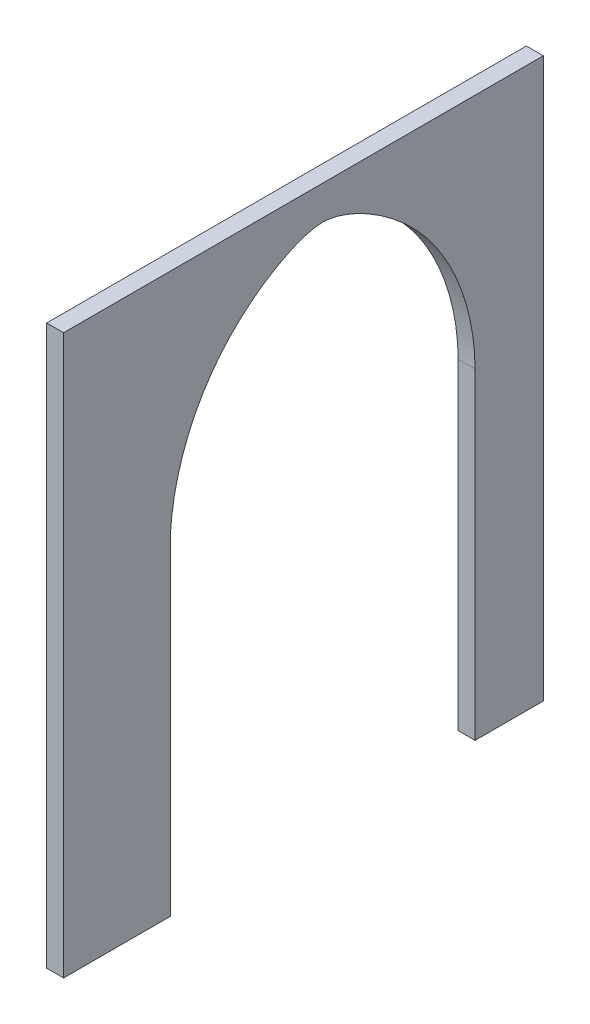
ISO-10303-21;
HEADER;
FILE_DESCRIPTION(('STEP AP214'),'2;1');
FILE_NAME('part.step','',(''),(''),'','','');
FILE_SCHEMA(('AUTOMOTIVE_DESIGN { 1 0 10303 214 1 1 1 1 }'));
ENDSEC;
DATA;
#1=APPLICATION_CONTEXT('core data for automotive mechanical design processes');
#2=APPLICATION_PROTOCOL_DEFINITION('international standard','automotive_design',2000,#1);
#3=PRODUCT_CONTEXT('',#1,'mechanical');
#4=PRODUCT('Part','Part','',(#3));
#5=PRODUCT_RELATED_PRODUCT_CATEGORY('part','',(#4));
#6=PRODUCT_DEFINITION_FORMATION('','',#4);
#7=PRODUCT_DEFINITION_CONTEXT('part definition',#1,'design');
#8=PRODUCT_DEFINITION('design','',#6,#7);
#9=PRODUCT_DEFINITION_SHAPE('','',#8);
#10=(LENGTH_UNIT() NAMED_UNIT(*) SI_UNIT(.MILLI.,.METRE.));
#11=(NAMED_UNIT(*) PLANE_ANGLE_UNIT() SI_UNIT($,.RADIAN.));
#12=(NAMED_UNIT(*) SI_UNIT($,.STERADIAN.) SOLID_ANGLE_UNIT());
#13=UNCERTAINTY_MEASURE_WITH_UNIT(LENGTH_MEASURE(1.E-05),#10,'distance_accuracy_value','');
#14=(GEOMETRIC_REPRESENTATION_CONTEXT(3) GLOBAL_UNCERTAINTY_ASSIGNED_CONTEXT((#13)) GLOBAL_UNIT_ASSIGNED_CONTEXT((#10,
#11,#12)) REPRESENTATION_CONTEXT('',''));
#15=CARTESIAN_POINT('',(0.,0.,0.));
#16=DIRECTION('',(0.,0.,1.));
#17=DIRECTION('',(1.,0.,0.));
#18=AXIS2_PLACEMENT_3D('',#15,#16,#17);
#19=CARTESIAN_POINT('',(595.,-635.,101.338597068016));
#20=DIRECTION('',(1.,0.,0.));
#21=DIRECTION('',(0.,1.,0.));
#22=AXIS2_PLACEMENT_3D('',#19,#20,#21);
#23=PLANE('',#22);
#24=DIRECTION('',(0.,0.,1.));
#25=VECTOR('',#24,1.);
#26=CARTESIAN_POINT('',(595.,-800.,242.977194136031));
#27=LINE('',#26,#25);
#28=CARTESIAN_POINT('',(595.,-800.,-40.3));
#29=VERTEX_POINT('',#28);
#30=CARTESIAN_POINT('',(595.,-800.,0.));
#31=VERTEX_POINT('',#30);
#32=EDGE_CURVE('E11',#29,#31,#27,.T.);
#33=ORIENTED_EDGE('',*,*,#32,.T.);
#34=DIRECTION('',(0.,1.,0.));
#35=VECTOR('',#34,1.);
#36=CARTESIAN_POINT('',(595.,-890.,0.));
#37=LINE('',#36,#35);
#38=CARTESIAN_POINT('',(595.,-610.,0.));
#39=VERTEX_POINT('',#38);
#40=EDGE_CURVE('E20',#31,#39,#37,.T.);
#41=ORIENTED_EDGE('',*,*,#40,.T.);
#42=CARTESIAN_POINT('',(595.,-610.,0.));
#43=CARTESIAN_POINT('',(595.,-607.078784666589,0.));
#44=CARTESIAN_POINT('',(595.,-601.118838253631,0.197661400638183));
#45=CARTESIAN_POINT('',(595.,-591.826391830275,1.08708198669646));
#46=CARTESIAN_POINT('',(595.,-578.820859051783,3.49931149063346));
#47=CARTESIAN_POINT('',(595.,-562.062676040517,8.76610130034009));
#48=CARTESIAN_POINT('',(595.,-545.512964245755,16.4928658029762));
#49=CARTESIAN_POINT('',(595.,-529.958861830291,26.7349755565135));
#50=CARTESIAN_POINT('',(595.,-516.173316725885,39.2472414722535));
#51=CARTESIAN_POINT('',(595.,-504.772887327885,53.1804665942254));
#52=CARTESIAN_POINT('',(595.,-496.226027489628,67.2507411920611));
#53=CARTESIAN_POINT('',(595.,-491.97245126361,77.5459269277937));
#54=CARTESIAN_POINT('',(595.,-490.358632607111,84.23316645146));
#55=CARTESIAN_POINT('',(595.,-490.,88.1653943535972));
#56=CARTESIAN_POINT('',(595.,-490.,90.));
#57=(BOUNDED_CURVE() B_SPLINE_CURVE(5,(#42,#43,#44,#45,#46,#47,#48,#49,#50,#51,#52,#53,#54,#55,
#56),.UNSPECIFIED.,.F.,.F.) B_SPLINE_CURVE_WITH_KNOTS((6,1,1,1,1,1,1,1,1,1,6),(-1.,-0.9,-0.8,
-0.7,-0.6,-0.5,-0.4,-0.3,-0.2,-0.1,0.),
.UNSPECIFIED.) CURVE() GEOMETRIC_REPRESENTATION_ITEM() RATIONAL_B_SPLINE_CURVE((1.,1.,1.,1.,1.,
1.,1.,1.,1.,1.,1.,1.,1.,1.,1.)) REPRESENTATION_ITEM(''));
#58=CARTESIAN_POINT('',(595.,-490.,90.));
#59=VERTEX_POINT('',#58);
#60=EDGE_CURVE('E118',#39,#59,#57,.T.);
#61=ORIENTED_EDGE('',*,*,#60,.T.);
#62=CARTESIAN_POINT('',(595.,-490.,90.));
#63=CARTESIAN_POINT('',(595.,-490.,91.8346056464028));
#64=CARTESIAN_POINT('',(595.,-490.358632607111,95.7668335485396));
#65=CARTESIAN_POINT('',(595.,-491.97245126361,102.454073072204));
#66=CARTESIAN_POINT('',(595.,-496.226027489628,112.749258807935));
#67=CARTESIAN_POINT('',(595.,-504.772887327885,126.819533405771));
#68=CARTESIAN_POINT('',(595.,-516.173316725885,140.752758527745));
#69=CARTESIAN_POINT('',(595.,-529.958861830291,153.265024443487));
#70=CARTESIAN_POINT('',(595.,-545.512964245755,163.507134197026));
#71=CARTESIAN_POINT('',(595.,-562.062676040517,171.233898699662));
#72=CARTESIAN_POINT('',(595.,-578.820859051783,176.500688509368));
#73=CARTESIAN_POINT('',(595.,-591.826391830275,178.912918013304));
#74=CARTESIAN_POINT('',(595.,-601.118838253631,179.802338599362));
#75=CARTESIAN_POINT('',(595.,-607.078784666589,180.));
#76=CARTESIAN_POINT('',(595.,-610.,180.));
#77=(BOUNDED_CURVE() B_SPLINE_CURVE(5,(#62,#63,#64,#65,#66,#67,#68,#69,#70,#71,#72,#73,#74,#75,
#76),.UNSPECIFIED.,.F.,.F.) B_SPLINE_CURVE_WITH_KNOTS((6,1,1,1,1,1,1,1,1,1,6),(0.,0.1,0.2,0.3,
0.4,0.5,0.6,0.7,0.8,0.9,1.),
.UNSPECIFIED.) CURVE() GEOMETRIC_REPRESENTATION_ITEM() RATIONAL_B_SPLINE_CURVE((1.,1.,1.,1.,1.,
1.,1.,1.,1.,1.,1.,1.,1.,1.,1.)) REPRESENTATION_ITEM(''));
#78=CARTESIAN_POINT('',(595.,-610.,180.));
#79=VERTEX_POINT('',#78);
#80=EDGE_CURVE('E126',#59,#79,#77,.T.);
#81=ORIENTED_EDGE('',*,*,#80,.T.);
#82=DIRECTION('',(0.,-1.,0.));
#83=VECTOR('',#82,1.);
#84=CARTESIAN_POINT('',(595.,-800.,180.));
#85=LINE('',#84,#83);
#86=CARTESIAN_POINT('',(595.,-800.,180.));
#87=VERTEX_POINT('',#86);
#88=EDGE_CURVE('E142',#79,#87,#85,.T.);
#89=ORIENTED_EDGE('',*,*,#88,.T.);
#90=DIRECTION('',(0.,0.,1.));
#91=VECTOR('',#90,1.);
#92=CARTESIAN_POINT('',(595.,-800.,242.977194136031));
#93=LINE('',#92,#91);
#94=CARTESIAN_POINT('',(595.,-800.,242.977194136031));
#95=VERTEX_POINT('',#94);
#96=EDGE_CURVE('E177',#87,#95,#93,.T.);
#97=ORIENTED_EDGE('',*,*,#96,.T.);
#98=DIRECTION('',(0.,1.,0.));
#99=VECTOR('',#98,1.);
#100=CARTESIAN_POINT('',(595.,-470.,242.977194136031));
#101=LINE('',#100,#99);
#102=CARTESIAN_POINT('',(595.,-470.,242.977194136031));
#103=VERTEX_POINT('',#102);
#104=EDGE_CURVE('E165',#95,#103,#101,.T.);
#105=ORIENTED_EDGE('',*,*,#104,.T.);
#106=DIRECTION('',(0.,0.,-1.));
#107=VECTOR('',#106,1.);
#108=CARTESIAN_POINT('',(595.,-470.,-40.3));
#109=LINE('',#108,#107);
#110=CARTESIAN_POINT('',(595.,-470.,-40.3));
#111=VERTEX_POINT('',#110);
#112=EDGE_CURVE('E148',#103,#111,#109,.T.);
#113=ORIENTED_EDGE('',*,*,#112,.T.);
#114=DIRECTION('',(0.,-1.,0.));
#115=VECTOR('',#114,1.);
#116=CARTESIAN_POINT('',(595.,-800.,-40.3));
#117=LINE('',#116,#115);
#118=EDGE_CURVE('E150',#111,#29,#117,.T.);
#119=ORIENTED_EDGE('',*,*,#118,.T.);
#120=EDGE_LOOP('',(#33,#41,#61,#81,#89,#97,#105,#113,#119));
#121=FACE_BOUND('',#120,.T.);
#122=ADVANCED_FACE('F16',(#121),#23,.F.);
#123=CARTESIAN_POINT('',(605.,-635.,101.338597068016));
#124=DIRECTION('',(1.,0.,0.));
#125=DIRECTION('',(0.,1.,0.));
#126=AXIS2_PLACEMENT_3D('',#123,#124,#125);
#127=PLANE('',#126);
#128=DIRECTION('',(0.,0.,-1.));
#129=VECTOR('',#128,1.);
#130=CARTESIAN_POINT('',(605.,-800.,242.977194136031));
#131=LINE('',#130,#129);
#132=CARTESIAN_POINT('',(605.,-800.,0.));
#133=VERTEX_POINT('',#132);
#134=CARTESIAN_POINT('',(605.,-800.,-40.3));
#135=VERTEX_POINT('',#134);
#136=EDGE_CURVE('E27',#133,#135,#131,.T.);
#137=ORIENTED_EDGE('',*,*,#136,.T.);
#138=DIRECTION('',(0.,1.,0.));
#139=VECTOR('',#138,1.);
#140=CARTESIAN_POINT('',(605.,-800.,-40.3));
#141=LINE('',#140,#139);
#142=CARTESIAN_POINT('',(605.,-470.,-40.3));
#143=VERTEX_POINT('',#142);
#144=EDGE_CURVE('E186',#135,#143,#141,.T.);
#145=ORIENTED_EDGE('',*,*,#144,.T.);
#146=DIRECTION('',(0.,0.,1.));
#147=VECTOR('',#146,1.);
#148=CARTESIAN_POINT('',(605.,-470.,-40.3));
#149=LINE('',#148,#147);
#150=CARTESIAN_POINT('',(605.,-470.,242.977194136031));
#151=VERTEX_POINT('',#150);
#152=EDGE_CURVE('E187',#143,#151,#149,.T.);
#153=ORIENTED_EDGE('',*,*,#152,.T.);
#154=DIRECTION('',(0.,-1.,0.));
#155=VECTOR('',#154,1.);
#156=CARTESIAN_POINT('',(605.,-470.,242.977194136031));
#157=LINE('',#156,#155);
#158=CARTESIAN_POINT('',(605.,-800.,242.977194136031));
#159=VERTEX_POINT('',#158);
#160=EDGE_CURVE('E182',#151,#159,#157,.T.);
#161=ORIENTED_EDGE('',*,*,#160,.T.);
#162=DIRECTION('',(0.,0.,-1.));
#163=VECTOR('',#162,1.);
#164=CARTESIAN_POINT('',(605.,-800.,242.977194136031));
#165=LINE('',#164,#163);
#166=CARTESIAN_POINT('',(605.,-800.,180.));
#167=VERTEX_POINT('',#166);
#168=EDGE_CURVE('E164',#159,#167,#165,.T.);
#169=ORIENTED_EDGE('',*,*,#168,.T.);
#170=DIRECTION('',(0.,1.,0.));
#171=VECTOR('',#170,1.);
#172=CARTESIAN_POINT('',(605.,-800.,180.));
#173=LINE('',#172,#171);
#174=CARTESIAN_POINT('',(605.,-610.,180.));
#175=VERTEX_POINT('',#174);
#176=EDGE_CURVE('E132',#167,#175,#173,.T.);
#177=ORIENTED_EDGE('',*,*,#176,.T.);
#178=CARTESIAN_POINT('',(605.,-490.,90.));
#179=CARTESIAN_POINT('',(605.,-490.,91.8346056464028));
#180=CARTESIAN_POINT('',(605.,-490.358632607111,95.7668335485396));
#181=CARTESIAN_POINT('',(605.,-491.97245126361,102.454073072204));
#182=CARTESIAN_POINT('',(605.,-496.226027489628,112.749258807935));
#183=CARTESIAN_POINT('',(605.,-504.772887327885,126.819533405771));
#184=CARTESIAN_POINT('',(605.,-516.173316725885,140.752758527745));
#185=CARTESIAN_POINT('',(605.,-529.958861830291,153.265024443487));
#186=CARTESIAN_POINT('',(605.,-545.512964245755,163.507134197026));
#187=CARTESIAN_POINT('',(605.,-562.062676040517,171.233898699662));
#188=CARTESIAN_POINT('',(605.,-578.820859051783,176.500688509368));
#189=CARTESIAN_POINT('',(605.,-591.826391830275,178.912918013304));
#190=CARTESIAN_POINT('',(605.,-601.118838253631,179.802338599362));
#191=CARTESIAN_POINT('',(605.,-607.078784666589,180.));
#192=CARTESIAN_POINT('',(605.,-610.,180.));
#193=(BOUNDED_CURVE() B_SPLINE_CURVE(5,(#178,#179,#180,#181,#182,#183,#184,#185,#186,#187,#188,
#189,#190,#191,#192),.UNSPECIFIED.,.F.,.F.) B_SPLINE_CURVE_WITH_KNOTS((6,1,1,1,1,1,1,1,1,1,6),
(0.,0.1,0.2,0.3,0.4,0.5,0.6,0.7,0.8,0.9,1.),
.UNSPECIFIED.) CURVE() GEOMETRIC_REPRESENTATION_ITEM() RATIONAL_B_SPLINE_CURVE((1.,1.,1.,1.,1.,
1.,1.,1.,1.,1.,1.,1.,1.,1.,1.)) REPRESENTATION_ITEM(''));
#194=CARTESIAN_POINT('',(605.,-490.,90.));
#195=VERTEX_POINT('',#194);
#196=EDGE_CURVE('E124',#195,#175,#193,.T.);
#197=ORIENTED_EDGE('',*,*,#196,.F.);
#198=CARTESIAN_POINT('',(605.,-610.,0.));
#199=CARTESIAN_POINT('',(605.,-607.078784666589,0.));
#200=CARTESIAN_POINT('',(605.,-601.118838253631,0.197661400638183));
#201=CARTESIAN_POINT('',(605.,-591.826391830275,1.08708198669646));
#202=CARTESIAN_POINT('',(605.,-578.820859051783,3.49931149063346));
#203=CARTESIAN_POINT('',(605.,-562.062676040517,8.76610130034009));
#204=CARTESIAN_POINT('',(605.,-545.512964245755,16.4928658029762));
#205=CARTESIAN_POINT('',(605.,-529.958861830291,26.7349755565135));
#206=CARTESIAN_POINT('',(605.,-516.173316725885,39.2472414722535));
#207=CARTESIAN_POINT('',(605.,-504.772887327885,53.1804665942254));
#208=CARTESIAN_POINT('',(605.,-496.226027489628,67.2507411920611));
#209=CARTESIAN_POINT('',(605.,-491.97245126361,77.5459269277937));
#210=CARTESIAN_POINT('',(605.,-490.358632607111,84.23316645146));
#211=CARTESIAN_POINT('',(605.,-490.,88.1653943535972));
#212=CARTESIAN_POINT('',(605.,-490.,90.));
#213=(BOUNDED_CURVE() B_SPLINE_CURVE(5,(#198,#199,#200,#201,#202,#203,#204,#205,#206,#207,#208,
#209,#210,#211,#212),.UNSPECIFIED.,.F.,.F.) B_SPLINE_CURVE_WITH_KNOTS((6,1,1,1,1,1,1,1,1,1,6),
(-1.,-0.9,-0.8,-0.7,-0.6,-0.5,-0.4,-0.3,-0.2,-0.1,0.),
.UNSPECIFIED.) CURVE() GEOMETRIC_REPRESENTATION_ITEM() RATIONAL_B_SPLINE_CURVE((1.,1.,1.,1.,1.,
1.,1.,1.,1.,1.,1.,1.,1.,1.,1.)) REPRESENTATION_ITEM(''));
#214=CARTESIAN_POINT('',(605.,-610.,0.));
#215=VERTEX_POINT('',#214);
#216=EDGE_CURVE('E106',#215,#195,#213,.T.);
#217=ORIENTED_EDGE('',*,*,#216,.F.);
#218=DIRECTION('',(0.,1.,0.));
#219=VECTOR('',#218,1.);
#220=CARTESIAN_POINT('',(605.,-890.,0.));
#221=LINE('',#220,#219);
#222=EDGE_CURVE('E210',#133,#215,#221,.T.);
#223=ORIENTED_EDGE('',*,*,#222,.F.);
#224=EDGE_LOOP('',(#137,#145,#153,#161,#169,#177,#197,#217,#223));
#225=FACE_BOUND('',#224,.T.);
#226=ADVANCED_FACE('F130',(#225),#127,.T.);
#227=CARTESIAN_POINT('',(605.,-800.,-40.3));
#228=DIRECTION('',(0.,-1.,0.));
#229=DIRECTION('',(0.,0.,-1.));
#230=AXIS2_PLACEMENT_3D('',#227,#228,#229);
#231=PLANE('',#230);
#232=ORIENTED_EDGE('',*,*,#136,.F.);
#233=DIRECTION('',(-1.,0.,0.));
#234=VECTOR('',#233,1.);
#235=CARTESIAN_POINT('',(605.,-800.,0.));
#236=LINE('',#235,#234);
#237=EDGE_CURVE('E174',#133,#31,#236,.T.);
#238=ORIENTED_EDGE('',*,*,#237,.T.);
#239=ORIENTED_EDGE('',*,*,#32,.F.);
#240=DIRECTION('',(-1.,0.,0.));
#241=VECTOR('',#240,1.);
#242=CARTESIAN_POINT('',(605.,-800.,-40.3));
#243=LINE('',#242,#241);
#244=EDGE_CURVE('E157',#135,#29,#243,.T.);
#245=ORIENTED_EDGE('',*,*,#244,.F.);
#246=EDGE_LOOP('',(#232,#238,#239,#245));
#247=FACE_BOUND('',#246,.T.);
#248=ADVANCED_FACE('F273',(#247),#231,.T.);
#249=CARTESIAN_POINT('',(605.,-800.,0.));
#250=DIRECTION('',(0.,0.,1.));
#251=DIRECTION('',(1.,0.,0.));
#252=AXIS2_PLACEMENT_3D('',#249,#250,#251);
#253=PLANE('',#252);
#254=ORIENTED_EDGE('',*,*,#222,.T.);
#255=DIRECTION('',(-1.,0.,0.));
#256=VECTOR('',#255,1.);
#257=CARTESIAN_POINT('',(605.,-610.,0.));
#258=LINE('',#257,#256);
#259=EDGE_CURVE('E113',#215,#39,#258,.T.);
#260=ORIENTED_EDGE('',*,*,#259,.T.);
#261=ORIENTED_EDGE('',*,*,#40,.F.);
#262=ORIENTED_EDGE('',*,*,#237,.F.);
#263=EDGE_LOOP('',(#254,#260,#261,#262));
#264=FACE_BOUND('',#263,.T.);
#265=ADVANCED_FACE('F277',(#264),#253,.T.);
#266=CARTESIAN_POINT('',(605.,-610.,0.));
#267=CARTESIAN_POINT('',(595.,-610.,0.));
#268=CARTESIAN_POINT('',(605.,-607.078784666589,0.));
#269=CARTESIAN_POINT('',(595.,-607.078784666589,0.));
#270=CARTESIAN_POINT('',(605.,-601.118838253631,0.197661400638183));
#271=CARTESIAN_POINT('',(595.,-601.118838253631,0.197661400638183));
#272=CARTESIAN_POINT('',(605.,-591.826391830275,1.08708198669646));
#273=CARTESIAN_POINT('',(595.,-591.826391830275,1.08708198669646));
#274=CARTESIAN_POINT('',(605.,-578.820859051783,3.49931149063346));
#275=CARTESIAN_POINT('',(595.,-578.820859051783,3.49931149063346));
#276=CARTESIAN_POINT('',(605.,-562.062676040517,8.76610130034009));
#277=CARTESIAN_POINT('',(595.,-562.062676040517,8.76610130034009));
#278=CARTESIAN_POINT('',(605.,-545.512964245755,16.4928658029762));
#279=CARTESIAN_POINT('',(595.,-545.512964245755,16.4928658029762));
#280=CARTESIAN_POINT('',(605.,-529.958861830291,26.7349755565135));
#281=CARTESIAN_POINT('',(595.,-529.958861830291,26.7349755565135));
#282=CARTESIAN_POINT('',(605.,-516.173316725885,39.2472414722535));
#283=CARTESIAN_POINT('',(595.,-516.173316725885,39.2472414722535));
#284=CARTESIAN_POINT('',(605.,-504.772887327885,53.1804665942254));
#285=CARTESIAN_POINT('',(595.,-504.772887327885,53.1804665942254));
#286=CARTESIAN_POINT('',(605.,-496.226027489628,67.2507411920611));
#287=CARTESIAN_POINT('',(595.,-496.226027489628,67.2507411920611));
#288=CARTESIAN_POINT('',(605.,-491.97245126361,77.5459269277937));
#289=CARTESIAN_POINT('',(595.,-491.97245126361,77.5459269277937));
#290=CARTESIAN_POINT('',(605.,-490.358632607111,84.23316645146));
#291=CARTESIAN_POINT('',(595.,-490.358632607111,84.23316645146));
#292=CARTESIAN_POINT('',(605.,-490.,88.1653943535972));
#293=CARTESIAN_POINT('',(595.,-490.,88.1653943535972));
#294=CARTESIAN_POINT('',(605.,-490.,90.));
#295=CARTESIAN_POINT('',(595.,-490.,90.));
#296=(BOUNDED_SURFACE() B_SPLINE_SURFACE(5,1,((#266,#267),(#268,#269),(#270,#271),(#272,#273),
(#274,#275),(#276,#277),(#278,#279),(#280,#281),(#282,#283),(#284,#285),(#286,#287),(#288,#289),
(#290,#291),(#292,#293),(#294,#295)),.UNSPECIFIED.,.F.,.F.,.F.) B_SPLINE_SURFACE_WITH_KNOTS((6,
1,1,1,1,1,1,1,1,1,6),(2,2),(-1.,-0.9,-0.8,-0.7,-0.6,-0.5,-0.4,-0.3,-0.2,-0.1,0.),(0.,1.),
.UNSPECIFIED.) GEOMETRIC_REPRESENTATION_ITEM() RATIONAL_B_SPLINE_SURFACE(((1.,1.),(1.,1.),(1.,
1.),(1.,1.),(1.,1.),(1.,1.),(1.,1.),(1.,1.),(1.,1.),(1.,1.),(1.,1.),(1.,1.),(1.,1.),(1.,1.),(1.,1.))) REPRESENTATION_ITEM('') SURFACE());
#297=DIRECTION('',(-1.,0.,0.));
#298=VECTOR('',#297,1.);
#299=CARTESIAN_POINT('',(605.,-490.,90.));
#300=LINE('',#299,#298);
#301=EDGE_CURVE('E110',#195,#59,#300,.T.);
#302=ORIENTED_EDGE('',*,*,#216,.T.);
#303=ORIENTED_EDGE('',*,*,#301,.T.);
#304=ORIENTED_EDGE('',*,*,#60,.F.);
#305=ORIENTED_EDGE('',*,*,#259,.F.);
#306=EDGE_LOOP('',(#302,#303,#304,#305));
#307=FACE_BOUND('',#306,.T.);
#308=ADVANCED_FACE('F108',(#307),#296,.T.);
#309=CARTESIAN_POINT('',(605.,-490.,90.));
#310=CARTESIAN_POINT('',(595.,-490.,90.));
#311=CARTESIAN_POINT('',(605.,-490.,91.8346056464028));
#312=CARTESIAN_POINT('',(595.,-490.,91.8346056464028));
#313=CARTESIAN_POINT('',(605.,-490.358632607111,95.7668335485396));
#314=CARTESIAN_POINT('',(595.,-490.358632607111,95.7668335485396));
#315=CARTESIAN_POINT('',(605.,-491.97245126361,102.454073072204));
#316=CARTESIAN_POINT('',(595.,-491.97245126361,102.454073072204));
#317=CARTESIAN_POINT('',(605.,-496.226027489628,112.749258807935));
#318=CARTESIAN_POINT('',(595.,-496.226027489628,112.749258807935));
#319=CARTESIAN_POINT('',(605.,-504.772887327885,126.819533405771));
#320=CARTESIAN_POINT('',(595.,-504.772887327885,126.819533405771));
#321=CARTESIAN_POINT('',(605.,-516.173316725885,140.752758527745));
#322=CARTESIAN_POINT('',(595.,-516.173316725885,140.752758527745));
#323=CARTESIAN_POINT('',(605.,-529.958861830291,153.265024443487));
#324=CARTESIAN_POINT('',(595.,-529.958861830291,153.265024443487));
#325=CARTESIAN_POINT('',(605.,-545.512964245755,163.507134197026));
#326=CARTESIAN_POINT('',(595.,-545.512964245755,163.507134197026));
#327=CARTESIAN_POINT('',(605.,-562.062676040517,171.233898699662));
#328=CARTESIAN_POINT('',(595.,-562.062676040517,171.233898699662));
#329=CARTESIAN_POINT('',(605.,-578.820859051783,176.500688509368));
#330=CARTESIAN_POINT('',(595.,-578.820859051783,176.500688509368));
#331=CARTESIAN_POINT('',(605.,-591.826391830275,178.912918013304));
#332=CARTESIAN_POINT('',(595.,-591.826391830275,178.912918013304));
#333=CARTESIAN_POINT('',(605.,-601.118838253631,179.802338599362));
#334=CARTESIAN_POINT('',(595.,-601.118838253631,179.802338599362));
#335=CARTESIAN_POINT('',(605.,-607.078784666589,180.));
#336=CARTESIAN_POINT('',(595.,-607.078784666589,180.));
#337=CARTESIAN_POINT('',(605.,-610.,180.));
#338=CARTESIAN_POINT('',(595.,-610.,180.));
#339=(BOUNDED_SURFACE() B_SPLINE_SURFACE(5,1,((#309,#310),(#311,#312),(#313,#314),(#315,#316),
(#317,#318),(#319,#320),(#321,#322),(#323,#324),(#325,#326),(#327,#328),(#329,#330),(#331,#332),
(#333,#334),(#335,#336),(#337,#338)),.UNSPECIFIED.,.F.,.F.,.F.) B_SPLINE_SURFACE_WITH_KNOTS((6,
1,1,1,1,1,1,1,1,1,6),(2,2),(0.,0.1,0.2,0.3,0.4,0.5,0.6,0.7,0.8,0.9,1.),(0.,1.),
.UNSPECIFIED.) GEOMETRIC_REPRESENTATION_ITEM() RATIONAL_B_SPLINE_SURFACE(((1.,1.),(1.,1.),(1.,
1.),(1.,1.),(1.,1.),(1.,1.),(1.,1.),(1.,1.),(1.,1.),(1.,1.),(1.,1.),(1.,1.),(1.,1.),(1.,1.),(1.,1.))) REPRESENTATION_ITEM('') SURFACE());
#340=DIRECTION('',(-1.,0.,0.));
#341=VECTOR('',#340,1.);
#342=CARTESIAN_POINT('',(605.,-610.,180.));
#343=LINE('',#342,#341);
#344=EDGE_CURVE('E134',#175,#79,#343,.T.);
#345=ORIENTED_EDGE('',*,*,#196,.T.);
#346=ORIENTED_EDGE('',*,*,#344,.T.);
#347=ORIENTED_EDGE('',*,*,#80,.F.);
#348=ORIENTED_EDGE('',*,*,#301,.F.);
#349=EDGE_LOOP('',(#345,#346,#347,#348));
#350=FACE_BOUND('',#349,.T.);
#351=ADVANCED_FACE('F122',(#350),#339,.T.);
#352=CARTESIAN_POINT('',(605.,-610.,180.));
#353=DIRECTION('',(0.,0.,-1.));
#354=DIRECTION('',(0.,-1.,0.));
#355=AXIS2_PLACEMENT_3D('',#352,#353,#354);
#356=PLANE('',#355);
#357=ORIENTED_EDGE('',*,*,#176,.F.);
#358=DIRECTION('',(-1.,0.,0.));
#359=VECTOR('',#358,1.);
#360=CARTESIAN_POINT('',(605.,-800.,180.));
#361=LINE('',#360,#359);
#362=EDGE_CURVE('E160',#167,#87,#361,.T.);
#363=ORIENTED_EDGE('',*,*,#362,.T.);
#364=ORIENTED_EDGE('',*,*,#88,.F.);
#365=ORIENTED_EDGE('',*,*,#344,.F.);
#366=EDGE_LOOP('',(#357,#363,#364,#365));
#367=FACE_BOUND('',#366,.T.);
#368=ADVANCED_FACE('F198',(#367),#356,.T.);
#369=CARTESIAN_POINT('',(605.,-800.,180.));
#370=DIRECTION('',(0.,-1.,0.));
#371=DIRECTION('',(0.,0.,-1.));
#372=AXIS2_PLACEMENT_3D('',#369,#370,#371);
#373=PLANE('',#372);
#374=ORIENTED_EDGE('',*,*,#168,.F.);
#375=DIRECTION('',(-1.,0.,0.));
#376=VECTOR('',#375,1.);
#377=CARTESIAN_POINT('',(605.,-800.,242.977194136031));
#378=LINE('',#377,#376);
#379=EDGE_CURVE('E161',#159,#95,#378,.T.);
#380=ORIENTED_EDGE('',*,*,#379,.T.);
#381=ORIENTED_EDGE('',*,*,#96,.F.);
#382=ORIENTED_EDGE('',*,*,#362,.F.);
#383=EDGE_LOOP('',(#374,#380,#381,#382));
#384=FACE_BOUND('',#383,.T.);
#385=ADVANCED_FACE('F200',(#384),#373,.T.);
#386=CARTESIAN_POINT('',(605.,-800.,242.977194136031));
#387=DIRECTION('',(0.,0.,1.));
#388=DIRECTION('',(1.,0.,0.));
#389=AXIS2_PLACEMENT_3D('',#386,#387,#388);
#390=PLANE('',#389);
#391=ORIENTED_EDGE('',*,*,#160,.F.);
#392=DIRECTION('',(-1.,0.,0.));
#393=VECTOR('',#392,1.);
#394=CARTESIAN_POINT('',(605.,-470.,242.977194136031));
#395=LINE('',#394,#393);
#396=EDGE_CURVE('E214',#151,#103,#395,.T.);
#397=ORIENTED_EDGE('',*,*,#396,.T.);
#398=ORIENTED_EDGE('',*,*,#104,.F.);
#399=ORIENTED_EDGE('',*,*,#379,.F.);
#400=EDGE_LOOP('',(#391,#397,#398,#399));
#401=FACE_BOUND('',#400,.T.);
#402=ADVANCED_FACE('F256',(#401),#390,.T.);
#403=CARTESIAN_POINT('',(605.,-470.,242.977194136031));
#404=DIRECTION('',(0.,1.,0.));
#405=DIRECTION('',(1.,0.,0.));
#406=AXIS2_PLACEMENT_3D('',#403,#404,#405);
#407=PLANE('',#406);
#408=ORIENTED_EDGE('',*,*,#152,.F.);
#409=DIRECTION('',(-1.,0.,0.));
#410=VECTOR('',#409,1.);
#411=CARTESIAN_POINT('',(605.,-470.,-40.3));
#412=LINE('',#411,#410);
#413=EDGE_CURVE('E156',#143,#111,#412,.T.);
#414=ORIENTED_EDGE('',*,*,#413,.T.);
#415=ORIENTED_EDGE('',*,*,#112,.F.);
#416=ORIENTED_EDGE('',*,*,#396,.F.);
#417=EDGE_LOOP('',(#408,#414,#415,#416));
#418=FACE_BOUND('',#417,.T.);
#419=ADVANCED_FACE('F253',(#418),#407,.T.);
#420=CARTESIAN_POINT('',(605.,-470.,-40.3));
#421=DIRECTION('',(0.,0.,-1.));
#422=DIRECTION('',(0.,-1.,0.));
#423=AXIS2_PLACEMENT_3D('',#420,#421,#422);
#424=PLANE('',#423);
#425=ORIENTED_EDGE('',*,*,#144,.F.);
#426=ORIENTED_EDGE('',*,*,#244,.T.);
#427=ORIENTED_EDGE('',*,*,#118,.F.);
#428=ORIENTED_EDGE('',*,*,#413,.F.);
#429=EDGE_LOOP('',(#425,#426,#427,#428));
#430=FACE_BOUND('',#429,.T.);
#431=ADVANCED_FACE('F18',(#430),#424,.T.);
#432=CLOSED_SHELL('',(#122,#226,#248,#265,#308,#351,#368,#385,#402,#419,#431));
#433=MANIFOLD_SOLID_BREP('B1',#432);
#434=ADVANCED_BREP_SHAPE_REPRESENTATION('',(#18,#433),#14);
#435=SHAPE_DEFINITION_REPRESENTATION(#9,#434);
ENDSEC;
END-ISO-10303-21;
